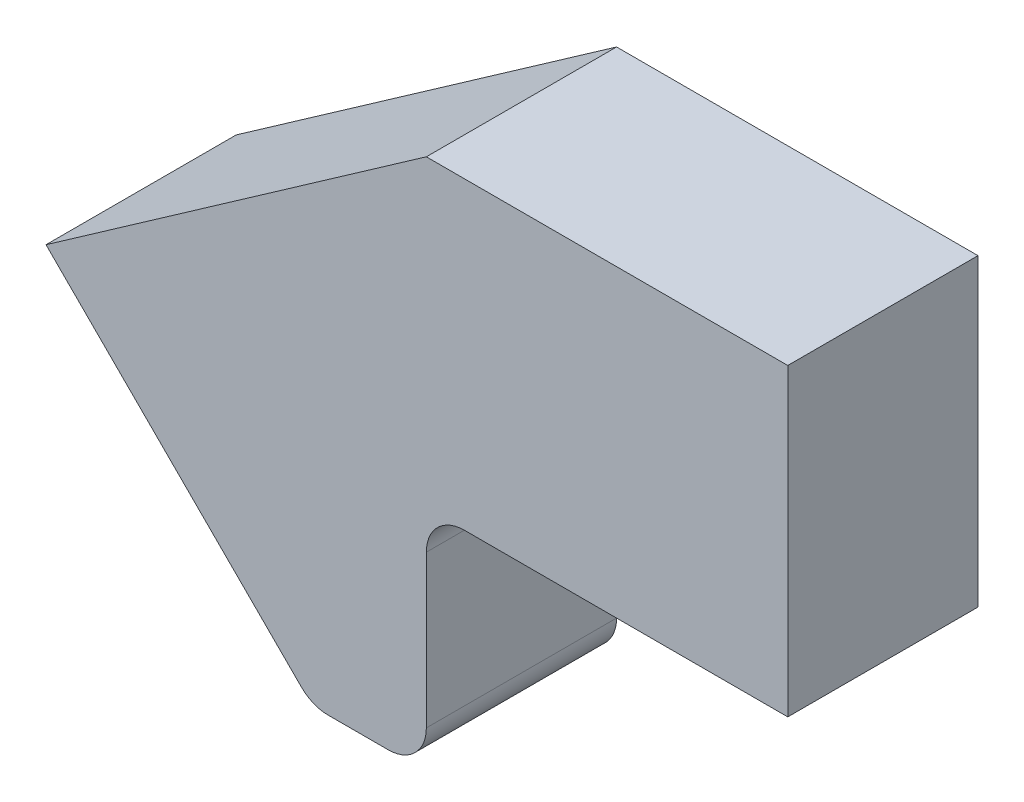
ISO-10303-21;
HEADER;
FILE_DESCRIPTION(('STEP AP214'),'2;1');
FILE_NAME('part.step','',(''),(''),'','','');
FILE_SCHEMA(('AUTOMOTIVE_DESIGN { 1 0 10303 214 1 1 1 1 }'));
ENDSEC;
DATA;
#1=APPLICATION_CONTEXT('core data for automotive mechanical design processes');
#2=APPLICATION_PROTOCOL_DEFINITION('international standard','automotive_design',2000,#1);
#3=PRODUCT_CONTEXT('',#1,'mechanical');
#4=PRODUCT('Part','Part','',(#3));
#5=PRODUCT_RELATED_PRODUCT_CATEGORY('part','',(#4));
#6=PRODUCT_DEFINITION_FORMATION('','',#4);
#7=PRODUCT_DEFINITION_CONTEXT('part definition',#1,'design');
#8=PRODUCT_DEFINITION('design','',#6,#7);
#9=PRODUCT_DEFINITION_SHAPE('','',#8);
#10=(LENGTH_UNIT() NAMED_UNIT(*) SI_UNIT(.MILLI.,.METRE.));
#11=(NAMED_UNIT(*) PLANE_ANGLE_UNIT() SI_UNIT($,.RADIAN.));
#12=(NAMED_UNIT(*) SI_UNIT($,.STERADIAN.) SOLID_ANGLE_UNIT());
#13=UNCERTAINTY_MEASURE_WITH_UNIT(LENGTH_MEASURE(1.E-05),#10,'distance_accuracy_value','');
#14=(GEOMETRIC_REPRESENTATION_CONTEXT(3) GLOBAL_UNCERTAINTY_ASSIGNED_CONTEXT((#13)) GLOBAL_UNIT_ASSIGNED_CONTEXT((#10,
#11,#12)) REPRESENTATION_CONTEXT('',''));
#15=CARTESIAN_POINT('',(0.,0.,0.));
#16=DIRECTION('',(0.,0.,1.));
#17=DIRECTION('',(1.,0.,0.));
#18=AXIS2_PLACEMENT_3D('',#15,#16,#17);
#19=CARTESIAN_POINT('',(0.350000000000004,-0.35,0.125));
#20=DIRECTION('',(0.707106781186544,0.707106781186552,0.));
#21=DIRECTION('',(-0.707106781186551,0.707106781186544,0.));
#22=AXIS2_PLACEMENT_3D('',#19,#20,#21);
#23=PLANE('',#22);
#24=DIRECTION('',(0.707106781186551,-0.707106781186544,0.));
#25=VECTOR('',#24,1.);
#26=CARTESIAN_POINT('',(0.350000000000004,-0.35,-0.125));
#27=LINE('',#26,#25);
#28=CARTESIAN_POINT('',(0.,0.,-0.125));
#29=VERTEX_POINT('',#28);
#30=CARTESIAN_POINT('',(0.335355339059331,-0.335355339059328,-0.125));
#31=VERTEX_POINT('',#30);
#32=EDGE_CURVE('E146',#29,#31,#27,.T.);
#33=ORIENTED_EDGE('',*,*,#32,.T.);
#34=DIRECTION('',(0.,0.,-1.));
#35=VECTOR('',#34,1.);
#36=CARTESIAN_POINT('',(0.335355339059331,-0.335355339059328,0.125));
#37=LINE('',#36,#35);
#38=CARTESIAN_POINT('',(0.335355339059331,-0.335355339059328,0.125));
#39=VERTEX_POINT('',#38);
#40=EDGE_CURVE('E48',#31,#39,#37,.F.);
#41=ORIENTED_EDGE('',*,*,#40,.T.);
#42=DIRECTION('',(0.707106781186551,-0.707106781186544,0.));
#43=VECTOR('',#42,1.);
#44=CARTESIAN_POINT('',(0.350000000000004,-0.35,0.125));
#45=LINE('',#44,#43);
#46=CARTESIAN_POINT('',(0.,0.,0.125));
#47=VERTEX_POINT('',#46);
#48=EDGE_CURVE('E160',#47,#39,#45,.T.);
#49=ORIENTED_EDGE('',*,*,#48,.F.);
#50=DIRECTION('',(0.,0.,-1.));
#51=VECTOR('',#50,1.);
#52=CARTESIAN_POINT('',(0.,0.,0.125));
#53=LINE('',#52,#51);
#54=EDGE_CURVE('E145',#47,#29,#53,.T.);
#55=ORIENTED_EDGE('',*,*,#54,.T.);
#56=EDGE_LOOP('',(#33,#41,#49,#55));
#57=FACE_BOUND('',#56,.T.);
#58=ADVANCED_FACE('F33',(#57),#23,.F.);
#59=CARTESIAN_POINT('',(0.499851802359739,-0.35,0.125));
#60=DIRECTION('',(0.,1.,0.));
#61=DIRECTION('',(0.,0.,1.));
#62=AXIS2_PLACEMENT_3D('',#59,#60,#61);
#63=PLANE('',#62);
#64=DIRECTION('',(1.,0.,0.));
#65=VECTOR('',#64,1.);
#66=CARTESIAN_POINT('',(0.499851802359739,-0.35,-0.125));
#67=LINE('',#66,#65);
#68=CARTESIAN_POINT('',(0.370710678118658,-0.35,-0.125));
#69=VERTEX_POINT('',#68);
#70=CARTESIAN_POINT('',(0.449851802359739,-0.35,-0.125));
#71=VERTEX_POINT('',#70);
#72=EDGE_CURVE('E148',#69,#71,#67,.T.);
#73=ORIENTED_EDGE('',*,*,#72,.T.);
#74=DIRECTION('',(0.,0.,-1.));
#75=VECTOR('',#74,1.);
#76=CARTESIAN_POINT('',(0.449851802359739,-0.35,0.125));
#77=LINE('',#76,#75);
#78=CARTESIAN_POINT('',(0.449851802359739,-0.35,0.125));
#79=VERTEX_POINT('',#78);
#80=EDGE_CURVE('E56',#71,#79,#77,.F.);
#81=ORIENTED_EDGE('',*,*,#80,.T.);
#82=DIRECTION('',(1.,0.,0.));
#83=VECTOR('',#82,1.);
#84=CARTESIAN_POINT('',(0.499851802359739,-0.35,0.125));
#85=LINE('',#84,#83);
#86=CARTESIAN_POINT('',(0.370710678118658,-0.35,0.125));
#87=VERTEX_POINT('',#86);
#88=EDGE_CURVE('E260',#87,#79,#85,.T.);
#89=ORIENTED_EDGE('',*,*,#88,.F.);
#90=DIRECTION('',(0.,0.,-1.));
#91=VECTOR('',#90,1.);
#92=CARTESIAN_POINT('',(0.370710678118658,-0.35,0.125));
#93=LINE('',#92,#91);
#94=EDGE_CURVE('E177',#87,#69,#93,.T.);
#95=ORIENTED_EDGE('',*,*,#94,.T.);
#96=EDGE_LOOP('',(#73,#81,#89,#95));
#97=FACE_BOUND('',#96,.T.);
#98=ADVANCED_FACE('F206',(#97),#63,.F.);
#99=CARTESIAN_POINT('',(0.499851802359739,-0.0500000000000001,0.125));
#100=DIRECTION('',(-1.,0.,0.));
#101=DIRECTION('',(0.,-1.,0.));
#102=AXIS2_PLACEMENT_3D('',#99,#100,#101);
#103=PLANE('',#102);
#104=DIRECTION('',(0.,1.,0.));
#105=VECTOR('',#104,1.);
#106=CARTESIAN_POINT('',(0.499851802359739,-0.0500000000000001,-0.125));
#107=LINE('',#106,#105);
#108=CARTESIAN_POINT('',(0.499851802359739,-0.3,-0.125));
#109=VERTEX_POINT('',#108);
#110=CARTESIAN_POINT('',(0.499851802359739,-0.1,-0.125));
#111=VERTEX_POINT('',#110);
#112=EDGE_CURVE('E150',#109,#111,#107,.T.);
#113=ORIENTED_EDGE('',*,*,#112,.T.);
#114=DIRECTION('',(0.,0.,-1.));
#115=VECTOR('',#114,1.);
#116=CARTESIAN_POINT('',(0.499851802359739,-0.1,0.125));
#117=LINE('',#116,#115);
#118=CARTESIAN_POINT('',(0.499851802359739,-0.1,0.125));
#119=VERTEX_POINT('',#118);
#120=EDGE_CURVE('E171',#111,#119,#117,.F.);
#121=ORIENTED_EDGE('',*,*,#120,.T.);
#122=DIRECTION('',(0.,1.,0.));
#123=VECTOR('',#122,1.);
#124=CARTESIAN_POINT('',(0.499851802359739,-0.0500000000000001,0.125));
#125=LINE('',#124,#123);
#126=CARTESIAN_POINT('',(0.499851802359739,-0.3,0.125));
#127=VERTEX_POINT('',#126);
#128=EDGE_CURVE('E123',#127,#119,#125,.T.);
#129=ORIENTED_EDGE('',*,*,#128,.F.);
#130=DIRECTION('',(0.,0.,-1.));
#131=VECTOR('',#130,1.);
#132=CARTESIAN_POINT('',(0.499851802359739,-0.3,0.125));
#133=LINE('',#132,#131);
#134=EDGE_CURVE('E168',#127,#109,#133,.T.);
#135=ORIENTED_EDGE('',*,*,#134,.T.);
#136=EDGE_LOOP('',(#113,#121,#129,#135));
#137=FACE_BOUND('',#136,.T.);
#138=ADVANCED_FACE('F191',(#137),#103,.F.);
#139=CARTESIAN_POINT('',(0.974851802359739,-0.05,0.125));
#140=DIRECTION('',(0.,1.,0.));
#141=DIRECTION('',(-1.,0.,0.));
#142=AXIS2_PLACEMENT_3D('',#139,#140,#141);
#143=PLANE('',#142);
#144=DIRECTION('',(1.,0.,0.));
#145=VECTOR('',#144,1.);
#146=CARTESIAN_POINT('',(0.974851802359739,-0.05,0.125));
#147=LINE('',#146,#145);
#148=CARTESIAN_POINT('',(0.549851802359739,-0.0500000000000001,0.125));
#149=VERTEX_POINT('',#148);
#150=CARTESIAN_POINT('',(0.974851802359739,-0.05,0.125));
#151=VERTEX_POINT('',#150);
#152=EDGE_CURVE('E112',#149,#151,#147,.T.);
#153=ORIENTED_EDGE('',*,*,#152,.F.);
#154=DIRECTION('',(0.,0.,-1.));
#155=VECTOR('',#154,1.);
#156=CARTESIAN_POINT('',(0.549851802359739,-0.0500000000000001,-0.125));
#157=LINE('',#156,#155);
#158=CARTESIAN_POINT('',(0.549851802359739,-0.0500000000000001,-0.125));
#159=VERTEX_POINT('',#158);
#160=EDGE_CURVE('E132',#149,#159,#157,.T.);
#161=ORIENTED_EDGE('',*,*,#160,.T.);
#162=DIRECTION('',(1.,0.,0.));
#163=VECTOR('',#162,1.);
#164=CARTESIAN_POINT('',(0.974851802359739,-0.05,-0.125));
#165=LINE('',#164,#163);
#166=CARTESIAN_POINT('',(0.974851802359739,-0.05,-0.125));
#167=VERTEX_POINT('',#166);
#168=EDGE_CURVE('E129',#159,#167,#165,.T.);
#169=ORIENTED_EDGE('',*,*,#168,.T.);
#170=DIRECTION('',(0.,0.,-1.));
#171=VECTOR('',#170,1.);
#172=CARTESIAN_POINT('',(0.974851802359739,-0.05,0.125));
#173=LINE('',#172,#171);
#174=EDGE_CURVE('E126',#151,#167,#173,.T.);
#175=ORIENTED_EDGE('',*,*,#174,.F.);
#176=EDGE_LOOP('',(#153,#161,#169,#175));
#177=FACE_BOUND('',#176,.T.);
#178=ADVANCED_FACE('F127',(#177),#143,.F.);
#179=CARTESIAN_POINT('',(0.974851802359739,0.35,0.125));
#180=DIRECTION('',(-1.,0.,0.));
#181=DIRECTION('',(0.,0.,1.));
#182=AXIS2_PLACEMENT_3D('',#179,#180,#181);
#183=PLANE('',#182);
#184=DIRECTION('',(0.,1.,0.));
#185=VECTOR('',#184,1.);
#186=CARTESIAN_POINT('',(0.974851802359739,0.35,-0.125));
#187=LINE('',#186,#185);
#188=CARTESIAN_POINT('',(0.974851802359739,0.35,-0.125));
#189=VERTEX_POINT('',#188);
#190=EDGE_CURVE('E154',#167,#189,#187,.T.);
#191=ORIENTED_EDGE('',*,*,#190,.T.);
#192=DIRECTION('',(0.,0.,-1.));
#193=VECTOR('',#192,1.);
#194=CARTESIAN_POINT('',(0.974851802359739,0.35,0.125));
#195=LINE('',#194,#193);
#196=CARTESIAN_POINT('',(0.974851802359739,0.35,0.125));
#197=VERTEX_POINT('',#196);
#198=EDGE_CURVE('E133',#197,#189,#195,.T.);
#199=ORIENTED_EDGE('',*,*,#198,.F.);
#200=DIRECTION('',(0.,1.,0.));
#201=VECTOR('',#200,1.);
#202=CARTESIAN_POINT('',(0.974851802359739,0.35,0.125));
#203=LINE('',#202,#201);
#204=EDGE_CURVE('E116',#151,#197,#203,.T.);
#205=ORIENTED_EDGE('',*,*,#204,.F.);
#206=ORIENTED_EDGE('',*,*,#174,.T.);
#207=EDGE_LOOP('',(#191,#199,#205,#206));
#208=FACE_BOUND('',#207,.T.);
#209=ADVANCED_FACE('F135',(#208),#183,.F.);
#210=CARTESIAN_POINT('',(0.499851802359739,0.35,0.125));
#211=DIRECTION('',(0.,-1.,0.));
#212=DIRECTION('',(0.,0.,-1.));
#213=AXIS2_PLACEMENT_3D('',#210,#211,#212);
#214=PLANE('',#213);
#215=DIRECTION('',(-1.,0.,0.));
#216=VECTOR('',#215,1.);
#217=CARTESIAN_POINT('',(0.499851802359739,0.35,-0.125));
#218=LINE('',#217,#216);
#219=CARTESIAN_POINT('',(0.499851802359739,0.35,-0.125));
#220=VERTEX_POINT('',#219);
#221=EDGE_CURVE('E156',#189,#220,#218,.T.);
#222=ORIENTED_EDGE('',*,*,#221,.T.);
#223=DIRECTION('',(0.,0.,-1.));
#224=VECTOR('',#223,1.);
#225=CARTESIAN_POINT('',(0.499851802359739,0.35,0.125));
#226=LINE('',#225,#224);
#227=CARTESIAN_POINT('',(0.499851802359739,0.35,0.125));
#228=VERTEX_POINT('',#227);
#229=EDGE_CURVE('E163',#228,#220,#226,.T.);
#230=ORIENTED_EDGE('',*,*,#229,.F.);
#231=DIRECTION('',(-1.,0.,0.));
#232=VECTOR('',#231,1.);
#233=CARTESIAN_POINT('',(0.499851802359739,0.35,0.125));
#234=LINE('',#233,#232);
#235=EDGE_CURVE('E138',#197,#228,#234,.T.);
#236=ORIENTED_EDGE('',*,*,#235,.F.);
#237=ORIENTED_EDGE('',*,*,#198,.T.);
#238=EDGE_LOOP('',(#222,#230,#236,#237));
#239=FACE_BOUND('',#238,.T.);
#240=ADVANCED_FACE('F218',(#239),#214,.F.);
#241=CARTESIAN_POINT('',(0.,0.,0.125));
#242=DIRECTION('',(0.573576436351047,-0.819152044288991,0.));
#243=DIRECTION('',(0.819152044288991,0.573576436351047,0.));
#244=AXIS2_PLACEMENT_3D('',#241,#242,#243);
#245=PLANE('',#244);
#246=DIRECTION('',(-0.819152044288991,-0.573576436351047,0.));
#247=VECTOR('',#246,1.);
#248=CARTESIAN_POINT('',(0.,0.,-0.125));
#249=LINE('',#248,#247);
#250=EDGE_CURVE('E158',#220,#29,#249,.T.);
#251=ORIENTED_EDGE('',*,*,#250,.T.);
#252=ORIENTED_EDGE('',*,*,#54,.F.);
#253=DIRECTION('',(-0.819152044288991,-0.573576436351047,0.));
#254=VECTOR('',#253,1.);
#255=CARTESIAN_POINT('',(0.,0.,0.125));
#256=LINE('',#255,#254);
#257=EDGE_CURVE('E140',#228,#47,#256,.T.);
#258=ORIENTED_EDGE('',*,*,#257,.F.);
#259=ORIENTED_EDGE('',*,*,#229,.T.);
#260=EDGE_LOOP('',(#251,#252,#258,#259));
#261=FACE_BOUND('',#260,.T.);
#262=ADVANCED_FACE('F221',(#261),#245,.F.);
#263=CARTESIAN_POINT('',(0.,0.,0.125));
#264=DIRECTION('',(0.,0.,-1.));
#265=DIRECTION('',(-1.,0.,0.));
#266=AXIS2_PLACEMENT_3D('',#263,#264,#265);
#267=PLANE('',#266);
#268=ORIENTED_EDGE('',*,*,#88,.T.);
#269=CARTESIAN_POINT('',(0.449851802359739,-0.3,0.125));
#270=DIRECTION('',(0.,0.,-1.));
#271=DIRECTION('',(-1.,0.,0.));
#272=AXIS2_PLACEMENT_3D('',#269,#270,#271);
#273=CIRCLE('',#272,0.05);
#274=EDGE_CURVE('E183',#79,#127,#273,.F.);
#275=ORIENTED_EDGE('',*,*,#274,.T.);
#276=ORIENTED_EDGE('',*,*,#128,.T.);
#277=CARTESIAN_POINT('',(0.549851802359739,-0.1,0.125));
#278=DIRECTION('',(0.,0.,-1.));
#279=DIRECTION('',(-1.,0.,0.));
#280=AXIS2_PLACEMENT_3D('',#277,#278,#279);
#281=CIRCLE('',#280,0.05);
#282=EDGE_CURVE('E11',#119,#149,#281,.T.);
#283=ORIENTED_EDGE('',*,*,#282,.T.);
#284=ORIENTED_EDGE('',*,*,#152,.T.);
#285=ORIENTED_EDGE('',*,*,#204,.T.);
#286=ORIENTED_EDGE('',*,*,#235,.T.);
#287=ORIENTED_EDGE('',*,*,#257,.T.);
#288=ORIENTED_EDGE('',*,*,#48,.T.);
#289=CARTESIAN_POINT('',(0.370710678118658,-0.3,0.125));
#290=DIRECTION('',(0.,0.,-1.));
#291=DIRECTION('',(-1.,0.,0.));
#292=AXIS2_PLACEMENT_3D('',#289,#290,#291);
#293=CIRCLE('',#292,0.05);
#294=EDGE_CURVE('E181',#39,#87,#293,.F.);
#295=ORIENTED_EDGE('',*,*,#294,.T.);
#296=EDGE_LOOP('',(#268,#275,#276,#283,#284,#285,#286,#287,#288,#295));
#297=FACE_BOUND('',#296,.T.);
#298=ADVANCED_FACE('F114',(#297),#267,.F.);
#299=CARTESIAN_POINT('',(0.,0.,-0.125));
#300=DIRECTION('',(0.,0.,-1.));
#301=DIRECTION('',(-1.,0.,0.));
#302=AXIS2_PLACEMENT_3D('',#299,#300,#301);
#303=PLANE('',#302);
#304=ORIENTED_EDGE('',*,*,#112,.F.);
#305=CARTESIAN_POINT('',(0.449851802359739,-0.3,-0.125));
#306=DIRECTION('',(0.,0.,-1.));
#307=DIRECTION('',(-1.,0.,0.));
#308=AXIS2_PLACEMENT_3D('',#305,#306,#307);
#309=CIRCLE('',#308,0.05);
#310=EDGE_CURVE('E175',#109,#71,#309,.T.);
#311=ORIENTED_EDGE('',*,*,#310,.T.);
#312=ORIENTED_EDGE('',*,*,#72,.F.);
#313=CARTESIAN_POINT('',(0.370710678118658,-0.3,-0.125));
#314=DIRECTION('',(0.,0.,-1.));
#315=DIRECTION('',(-1.,0.,0.));
#316=AXIS2_PLACEMENT_3D('',#313,#314,#315);
#317=CIRCLE('',#316,0.05);
#318=EDGE_CURVE('E173',#69,#31,#317,.T.);
#319=ORIENTED_EDGE('',*,*,#318,.T.);
#320=ORIENTED_EDGE('',*,*,#32,.F.);
#321=ORIENTED_EDGE('',*,*,#250,.F.);
#322=ORIENTED_EDGE('',*,*,#221,.F.);
#323=ORIENTED_EDGE('',*,*,#190,.F.);
#324=ORIENTED_EDGE('',*,*,#168,.F.);
#325=CARTESIAN_POINT('',(0.549851802359739,-0.1,-0.125));
#326=DIRECTION('',(0.,0.,-1.));
#327=DIRECTION('',(-1.,0.,0.));
#328=AXIS2_PLACEMENT_3D('',#325,#326,#327);
#329=CIRCLE('',#328,0.05);
#330=EDGE_CURVE('E41',#159,#111,#329,.F.);
#331=ORIENTED_EDGE('',*,*,#330,.T.);
#332=EDGE_LOOP('',(#304,#311,#312,#319,#320,#321,#322,#323,#324,#331));
#333=FACE_BOUND('',#332,.T.);
#334=ADVANCED_FACE('F187',(#333),#303,.T.);
#335=CARTESIAN_POINT('',(0.549851802359739,-0.1,0.125));
#336=DIRECTION('',(0.,0.,1.));
#337=DIRECTION('',(1.,0.,0.));
#338=AXIS2_PLACEMENT_3D('',#335,#336,#337);
#339=CYLINDRICAL_SURFACE('',#338,0.05);
#340=ORIENTED_EDGE('',*,*,#282,.F.);
#341=ORIENTED_EDGE('',*,*,#120,.F.);
#342=ORIENTED_EDGE('',*,*,#330,.F.);
#343=ORIENTED_EDGE('',*,*,#160,.F.);
#344=EDGE_LOOP('',(#340,#341,#342,#343));
#345=FACE_BOUND('',#344,.T.);
#346=ADVANCED_FACE('F194',(#345),#339,.F.);
#347=CARTESIAN_POINT('',(0.449851802359739,-0.3,0.125));
#348=DIRECTION('',(0.,0.,-1.));
#349=DIRECTION('',(-1.,0.,0.));
#350=AXIS2_PLACEMENT_3D('',#347,#348,#349);
#351=CYLINDRICAL_SURFACE('',#350,0.05);
#352=ORIENTED_EDGE('',*,*,#274,.F.);
#353=ORIENTED_EDGE('',*,*,#80,.F.);
#354=ORIENTED_EDGE('',*,*,#310,.F.);
#355=ORIENTED_EDGE('',*,*,#134,.F.);
#356=EDGE_LOOP('',(#352,#353,#354,#355));
#357=FACE_BOUND('',#356,.T.);
#358=ADVANCED_FACE('F196',(#357),#351,.T.);
#359=CARTESIAN_POINT('',(0.370710678118658,-0.3,0.125));
#360=DIRECTION('',(0.,0.,-1.));
#361=DIRECTION('',(-1.,0.,0.));
#362=AXIS2_PLACEMENT_3D('',#359,#360,#361);
#363=CYLINDRICAL_SURFACE('',#362,0.05);
#364=ORIENTED_EDGE('',*,*,#294,.F.);
#365=ORIENTED_EDGE('',*,*,#40,.F.);
#366=ORIENTED_EDGE('',*,*,#318,.F.);
#367=ORIENTED_EDGE('',*,*,#94,.F.);
#368=EDGE_LOOP('',(#364,#365,#366,#367));
#369=FACE_BOUND('',#368,.T.);
#370=ADVANCED_FACE('F35',(#369),#363,.T.);
#371=CLOSED_SHELL('',(#58,#98,#138,#178,#209,#240,#262,#298,#334,#346,#358,#370));
#372=MANIFOLD_SOLID_BREP('B2',#371);
#373=ADVANCED_BREP_SHAPE_REPRESENTATION('',(#18,#372),#14);
#374=SHAPE_DEFINITION_REPRESENTATION(#9,#373);
ENDSEC;
END-ISO-10303-21;
